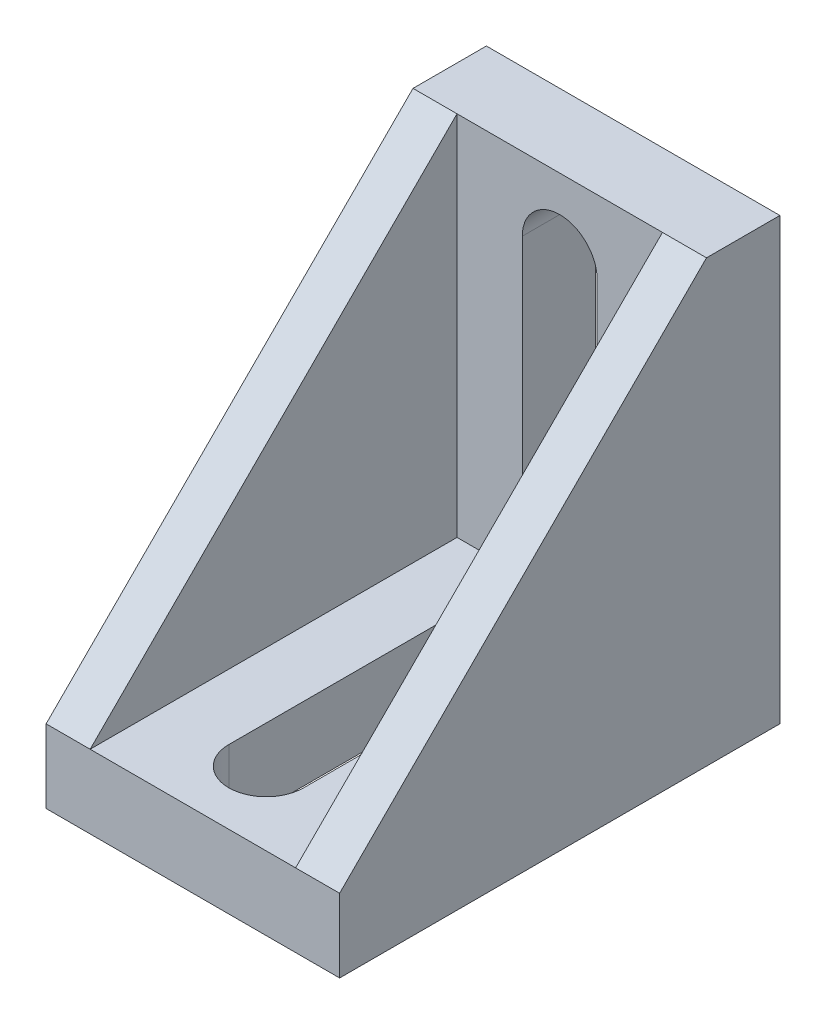
ISO-10303-21;
HEADER;
FILE_DESCRIPTION(('STEP AP214'),'2;1');
FILE_NAME('part.step','',(''),(''),'','','');
FILE_SCHEMA(('AUTOMOTIVE_DESIGN { 1 0 10303 214 1 1 1 1 }'));
ENDSEC;
DATA;
#1=APPLICATION_CONTEXT('core data for automotive mechanical design processes');
#2=APPLICATION_PROTOCOL_DEFINITION('international standard','automotive_design',2000,#1);
#3=PRODUCT_CONTEXT('',#1,'mechanical');
#4=PRODUCT('Part','Part','',(#3));
#5=PRODUCT_RELATED_PRODUCT_CATEGORY('part','',(#4));
#6=PRODUCT_DEFINITION_FORMATION('','',#4);
#7=PRODUCT_DEFINITION_CONTEXT('part definition',#1,'design');
#8=PRODUCT_DEFINITION('design','',#6,#7);
#9=PRODUCT_DEFINITION_SHAPE('','',#8);
#10=(LENGTH_UNIT() NAMED_UNIT(*) SI_UNIT(.MILLI.,.METRE.));
#11=(NAMED_UNIT(*) PLANE_ANGLE_UNIT() SI_UNIT($,.RADIAN.));
#12=(NAMED_UNIT(*) SI_UNIT($,.STERADIAN.) SOLID_ANGLE_UNIT());
#13=UNCERTAINTY_MEASURE_WITH_UNIT(LENGTH_MEASURE(1.E-05),#10,'distance_accuracy_value','');
#14=(GEOMETRIC_REPRESENTATION_CONTEXT(3) GLOBAL_UNCERTAINTY_ASSIGNED_CONTEXT((#13)) GLOBAL_UNIT_ASSIGNED_CONTEXT((#10,
#11,#12)) REPRESENTATION_CONTEXT('',''));
#15=CARTESIAN_POINT('',(0.,0.,0.));
#16=DIRECTION('',(0.,0.,1.));
#17=DIRECTION('',(1.,0.,0.));
#18=AXIS2_PLACEMENT_3D('',#15,#16,#17);
#19=CARTESIAN_POINT('',(0.,0.,30.));
#20=DIRECTION('',(0.,0.,-1.));
#21=DIRECTION('',(-1.,0.,0.));
#22=AXIS2_PLACEMENT_3D('',#19,#20,#21);
#23=PLANE('',#22);
#24=DIRECTION('',(0.,1.,0.));
#25=VECTOR('',#24,1.);
#26=CARTESIAN_POINT('',(20.,0.,30.));
#27=LINE('',#26,#25);
#28=CARTESIAN_POINT('',(20.,0.,30.));
#29=VERTEX_POINT('',#28);
#30=CARTESIAN_POINT('',(20.,5.,30.));
#31=VERTEX_POINT('',#30);
#32=EDGE_CURVE('E244',#29,#31,#27,.T.);
#33=ORIENTED_EDGE('',*,*,#32,.T.);
#34=DIRECTION('',(1.,0.,0.));
#35=VECTOR('',#34,1.);
#36=CARTESIAN_POINT('',(0.,5.,30.));
#37=LINE('',#36,#35);
#38=CARTESIAN_POINT('',(17.,5.,30.));
#39=VERTEX_POINT('',#38);
#40=EDGE_CURVE('E208',#39,#31,#37,.T.);
#41=ORIENTED_EDGE('',*,*,#40,.F.);
#42=DIRECTION('',(1.,0.,0.));
#43=VECTOR('',#42,1.);
#44=CARTESIAN_POINT('',(0.,5.,30.));
#45=LINE('',#44,#43);
#46=CARTESIAN_POINT('',(3.,5.,30.));
#47=VERTEX_POINT('',#46);
#48=EDGE_CURVE('E231',#47,#39,#45,.T.);
#49=ORIENTED_EDGE('',*,*,#48,.F.);
#50=CARTESIAN_POINT('',(0.,5.,30.));
#51=VERTEX_POINT('',#50);
#52=EDGE_CURVE('E205',#51,#47,#37,.T.);
#53=ORIENTED_EDGE('',*,*,#52,.F.);
#54=DIRECTION('',(0.,-1.,0.));
#55=VECTOR('',#54,1.);
#56=CARTESIAN_POINT('',(0.,0.,30.));
#57=LINE('',#56,#55);
#58=CARTESIAN_POINT('',(0.,0.,30.));
#59=VERTEX_POINT('',#58);
#60=EDGE_CURVE('E239',#51,#59,#57,.T.);
#61=ORIENTED_EDGE('',*,*,#60,.T.);
#62=DIRECTION('',(1.,0.,0.));
#63=VECTOR('',#62,1.);
#64=CARTESIAN_POINT('',(0.,0.,30.));
#65=LINE('',#64,#63);
#66=EDGE_CURVE('E241',#59,#29,#65,.T.);
#67=ORIENTED_EDGE('',*,*,#66,.T.);
#68=EDGE_LOOP('',(#33,#41,#49,#53,#61,#67));
#69=FACE_BOUND('',#68,.T.);
#70=ADVANCED_FACE('F38',(#69),#23,.F.);
#71=CARTESIAN_POINT('',(0.,0.,30.));
#72=DIRECTION('',(1.,0.,0.));
#73=DIRECTION('',(0.,0.,-1.));
#74=AXIS2_PLACEMENT_3D('',#71,#72,#73);
#75=PLANE('',#74);
#76=ORIENTED_EDGE('',*,*,#60,.F.);
#77=DIRECTION('',(0.,0.707106781186547,-0.707106781186547));
#78=VECTOR('',#77,1.);
#79=CARTESIAN_POINT('',(0.,5.,30.));
#80=LINE('',#79,#78);
#81=CARTESIAN_POINT('',(0.,30.,5.));
#82=VERTEX_POINT('',#81);
#83=EDGE_CURVE('E194',#51,#82,#80,.T.);
#84=ORIENTED_EDGE('',*,*,#83,.T.);
#85=DIRECTION('',(0.,0.,-1.));
#86=VECTOR('',#85,1.);
#87=CARTESIAN_POINT('',(0.,30.,30.));
#88=LINE('',#87,#86);
#89=CARTESIAN_POINT('',(0.,30.,0.));
#90=VERTEX_POINT('',#89);
#91=EDGE_CURVE('E247',#82,#90,#88,.T.);
#92=ORIENTED_EDGE('',*,*,#91,.T.);
#93=DIRECTION('',(0.,-1.,0.));
#94=VECTOR('',#93,1.);
#95=CARTESIAN_POINT('',(0.,0.,0.));
#96=LINE('',#95,#94);
#97=CARTESIAN_POINT('',(0.,0.,0.));
#98=VERTEX_POINT('',#97);
#99=EDGE_CURVE('E225',#90,#98,#96,.T.);
#100=ORIENTED_EDGE('',*,*,#99,.T.);
#101=DIRECTION('',(0.,0.,-1.));
#102=VECTOR('',#101,1.);
#103=CARTESIAN_POINT('',(0.,0.,30.));
#104=LINE('',#103,#102);
#105=EDGE_CURVE('E263',#59,#98,#104,.T.);
#106=ORIENTED_EDGE('',*,*,#105,.F.);
#107=EDGE_LOOP('',(#76,#84,#92,#100,#106));
#108=FACE_BOUND('',#107,.T.);
#109=ADVANCED_FACE('F40',(#108),#75,.F.);
#110=CARTESIAN_POINT('',(0.,0.,30.));
#111=DIRECTION('',(0.,1.,0.));
#112=DIRECTION('',(0.,0.,1.));
#113=AXIS2_PLACEMENT_3D('',#110,#111,#112);
#114=PLANE('',#113);
#115=DIRECTION('',(0.,0.,-1.));
#116=VECTOR('',#115,1.);
#117=CARTESIAN_POINT('',(7.4475,0.,25.));
#118=LINE('',#117,#116);
#119=CARTESIAN_POINT('',(7.4475,0.,25.));
#120=VERTEX_POINT('',#119);
#121=CARTESIAN_POINT('',(7.4475,-2.09901540593194E-13,10.0000000000001));
#122=VERTEX_POINT('',#121);
#123=EDGE_CURVE('E162',#120,#122,#118,.T.);
#124=ORIENTED_EDGE('',*,*,#123,.F.);
#125=CARTESIAN_POINT('',(10.,0.,25.));
#126=DIRECTION('',(0.,-1.,0.));
#127=DIRECTION('',(1.,0.,0.));
#128=AXIS2_PLACEMENT_3D('',#125,#126,#127);
#129=CIRCLE('',#128,2.5525);
#130=CARTESIAN_POINT('',(12.5525,0.,25.));
#131=VERTEX_POINT('',#130);
#132=EDGE_CURVE('E53',#131,#120,#129,.T.);
#133=ORIENTED_EDGE('',*,*,#132,.F.);
#134=DIRECTION('',(0.,0.,1.));
#135=VECTOR('',#134,1.);
#136=CARTESIAN_POINT('',(12.5525,0.,25.));
#137=LINE('',#136,#135);
#138=CARTESIAN_POINT('',(12.5525,-2.09901540593194E-13,10.0000000000001));
#139=VERTEX_POINT('',#138);
#140=EDGE_CURVE('E169',#139,#131,#137,.T.);
#141=ORIENTED_EDGE('',*,*,#140,.F.);
#142=CARTESIAN_POINT('',(10.,-2.09901540593194E-13,10.0000000000001));
#143=DIRECTION('',(0.,-1.,0.));
#144=DIRECTION('',(1.,0.,0.));
#145=AXIS2_PLACEMENT_3D('',#142,#143,#144);
#146=CIRCLE('',#145,2.5525);
#147=EDGE_CURVE('E153',#122,#139,#146,.T.);
#148=ORIENTED_EDGE('',*,*,#147,.F.);
#149=EDGE_LOOP('',(#124,#133,#141,#148));
#150=FACE_BOUND('',#149,.T.);
#151=DIRECTION('',(1.,0.,0.));
#152=VECTOR('',#151,1.);
#153=CARTESIAN_POINT('',(0.,0.,0.));
#154=LINE('',#153,#152);
#155=CARTESIAN_POINT('',(20.,0.,0.));
#156=VERTEX_POINT('',#155);
#157=EDGE_CURVE('E250',#98,#156,#154,.T.);
#158=ORIENTED_EDGE('',*,*,#157,.T.);
#159=DIRECTION('',(0.,0.,-1.));
#160=VECTOR('',#159,1.);
#161=CARTESIAN_POINT('',(20.,0.,30.));
#162=LINE('',#161,#160);
#163=EDGE_CURVE('E260',#29,#156,#162,.T.);
#164=ORIENTED_EDGE('',*,*,#163,.F.);
#165=ORIENTED_EDGE('',*,*,#66,.F.);
#166=ORIENTED_EDGE('',*,*,#105,.T.);
#167=EDGE_LOOP('',(#158,#164,#165,#166));
#168=FACE_BOUND('',#167,.T.);
#169=ADVANCED_FACE('F166',(#150,#168),#114,.F.);
#170=CARTESIAN_POINT('',(20.,0.,30.));
#171=DIRECTION('',(-1.,0.,0.));
#172=DIRECTION('',(0.,-1.,0.));
#173=AXIS2_PLACEMENT_3D('',#170,#171,#172);
#174=PLANE('',#173);
#175=DIRECTION('',(0.,0.,-1.));
#176=VECTOR('',#175,1.);
#177=CARTESIAN_POINT('',(20.,30.,30.));
#178=LINE('',#177,#176);
#179=CARTESIAN_POINT('',(20.,30.,5.));
#180=VERTEX_POINT('',#179);
#181=CARTESIAN_POINT('',(20.,30.,0.));
#182=VERTEX_POINT('',#181);
#183=EDGE_CURVE('E258',#180,#182,#178,.T.);
#184=ORIENTED_EDGE('',*,*,#183,.F.);
#185=DIRECTION('',(0.,-0.707106781186548,0.707106781186548));
#186=VECTOR('',#185,1.);
#187=CARTESIAN_POINT('',(20.,2.5,32.5));
#188=LINE('',#187,#186);
#189=EDGE_CURVE('E215',#180,#31,#188,.T.);
#190=ORIENTED_EDGE('',*,*,#189,.T.);
#191=ORIENTED_EDGE('',*,*,#32,.F.);
#192=ORIENTED_EDGE('',*,*,#163,.T.);
#193=DIRECTION('',(0.,1.,0.));
#194=VECTOR('',#193,1.);
#195=CARTESIAN_POINT('',(20.,0.,0.));
#196=LINE('',#195,#194);
#197=EDGE_CURVE('E252',#156,#182,#196,.T.);
#198=ORIENTED_EDGE('',*,*,#197,.T.);
#199=EDGE_LOOP('',(#184,#190,#191,#192,#198));
#200=FACE_BOUND('',#199,.T.);
#201=ADVANCED_FACE('F321',(#200),#174,.F.);
#202=CARTESIAN_POINT('',(0.,30.,30.));
#203=DIRECTION('',(0.,-1.,0.));
#204=DIRECTION('',(0.,0.,-1.));
#205=AXIS2_PLACEMENT_3D('',#202,#203,#204);
#206=PLANE('',#205);
#207=ORIENTED_EDGE('',*,*,#91,.F.);
#208=DIRECTION('',(1.,0.,0.));
#209=VECTOR('',#208,1.);
#210=CARTESIAN_POINT('',(0.,30.,5.));
#211=LINE('',#210,#209);
#212=CARTESIAN_POINT('',(3.,30.,5.));
#213=VERTEX_POINT('',#212);
#214=EDGE_CURVE('E209',#82,#213,#211,.T.);
#215=ORIENTED_EDGE('',*,*,#214,.T.);
#216=DIRECTION('',(-1.,0.,0.));
#217=VECTOR('',#216,1.);
#218=CARTESIAN_POINT('',(0.,30.,5.));
#219=LINE('',#218,#217);
#220=CARTESIAN_POINT('',(17.,30.,5.));
#221=VERTEX_POINT('',#220);
#222=EDGE_CURVE('E234',#221,#213,#219,.T.);
#223=ORIENTED_EDGE('',*,*,#222,.F.);
#224=EDGE_CURVE('E204',#221,#180,#211,.T.);
#225=ORIENTED_EDGE('',*,*,#224,.T.);
#226=ORIENTED_EDGE('',*,*,#183,.T.);
#227=DIRECTION('',(-1.,0.,0.));
#228=VECTOR('',#227,1.);
#229=CARTESIAN_POINT('',(0.,30.,0.));
#230=LINE('',#229,#228);
#231=EDGE_CURVE('E242',#182,#90,#230,.T.);
#232=ORIENTED_EDGE('',*,*,#231,.T.);
#233=EDGE_LOOP('',(#207,#215,#223,#225,#226,#232));
#234=FACE_BOUND('',#233,.T.);
#235=ADVANCED_FACE('F317',(#234),#206,.F.);
#236=CARTESIAN_POINT('',(0.,0.,0.));
#237=DIRECTION('',(0.,0.,-1.));
#238=DIRECTION('',(-1.,0.,0.));
#239=AXIS2_PLACEMENT_3D('',#236,#237,#238);
#240=PLANE('',#239);
#241=CARTESIAN_POINT('',(10.,25.,0.));
#242=DIRECTION('',(0.,0.,1.));
#243=DIRECTION('',(1.,0.,0.));
#244=AXIS2_PLACEMENT_3D('',#241,#242,#243);
#245=CIRCLE('',#244,2.5525);
#246=CARTESIAN_POINT('',(12.5525,25.,0.));
#247=VERTEX_POINT('',#246);
#248=CARTESIAN_POINT('',(7.4475,25.,0.));
#249=VERTEX_POINT('',#248);
#250=EDGE_CURVE('E176',#247,#249,#245,.T.);
#251=ORIENTED_EDGE('',*,*,#250,.T.);
#252=DIRECTION('',(0.,-1.,0.));
#253=VECTOR('',#252,1.);
#254=CARTESIAN_POINT('',(7.4475,25.,0.));
#255=LINE('',#254,#253);
#256=CARTESIAN_POINT('',(7.4475,10.,0.));
#257=VERTEX_POINT('',#256);
#258=EDGE_CURVE('E181',#249,#257,#255,.T.);
#259=ORIENTED_EDGE('',*,*,#258,.T.);
#260=CARTESIAN_POINT('',(10.,10.,0.));
#261=DIRECTION('',(0.,0.,1.));
#262=DIRECTION('',(1.,0.,0.));
#263=AXIS2_PLACEMENT_3D('',#260,#261,#262);
#264=CIRCLE('',#263,2.5525);
#265=CARTESIAN_POINT('',(12.5525,10.,0.));
#266=VERTEX_POINT('',#265);
#267=EDGE_CURVE('E184',#257,#266,#264,.T.);
#268=ORIENTED_EDGE('',*,*,#267,.T.);
#269=DIRECTION('',(0.,1.,0.));
#270=VECTOR('',#269,1.);
#271=CARTESIAN_POINT('',(12.5525,25.,0.));
#272=LINE('',#271,#270);
#273=EDGE_CURVE('E187',#266,#247,#272,.T.);
#274=ORIENTED_EDGE('',*,*,#273,.T.);
#275=EDGE_LOOP('',(#251,#259,#268,#274));
#276=FACE_BOUND('',#275,.T.);
#277=ORIENTED_EDGE('',*,*,#99,.F.);
#278=ORIENTED_EDGE('',*,*,#231,.F.);
#279=ORIENTED_EDGE('',*,*,#197,.F.);
#280=ORIENTED_EDGE('',*,*,#157,.F.);
#281=EDGE_LOOP('',(#277,#278,#279,#280));
#282=FACE_BOUND('',#281,.T.);
#283=ADVANCED_FACE('F313',(#276,#282),#240,.T.);
#284=CARTESIAN_POINT('',(3.,0.,30.));
#285=DIRECTION('',(1.,0.,0.));
#286=DIRECTION('',(0.,0.,-1.));
#287=AXIS2_PLACEMENT_3D('',#284,#285,#286);
#288=PLANE('',#287);
#289=DIRECTION('',(0.,0.707106781186548,-0.707106781186548));
#290=VECTOR('',#289,1.);
#291=CARTESIAN_POINT('',(3.,2.5,32.5));
#292=LINE('',#291,#290);
#293=EDGE_CURVE('E213',#47,#213,#292,.T.);
#294=ORIENTED_EDGE('',*,*,#293,.F.);
#295=DIRECTION('',(0.,0.,-1.));
#296=VECTOR('',#295,1.);
#297=CARTESIAN_POINT('',(3.,5.,30.));
#298=LINE('',#297,#296);
#299=CARTESIAN_POINT('',(3.,5.,5.));
#300=VERTEX_POINT('',#299);
#301=EDGE_CURVE('E222',#47,#300,#298,.T.);
#302=ORIENTED_EDGE('',*,*,#301,.T.);
#303=DIRECTION('',(0.,-1.,0.));
#304=VECTOR('',#303,1.);
#305=CARTESIAN_POINT('',(3.,0.,5.));
#306=LINE('',#305,#304);
#307=EDGE_CURVE('E218',#213,#300,#306,.T.);
#308=ORIENTED_EDGE('',*,*,#307,.F.);
#309=EDGE_LOOP('',(#294,#302,#308));
#310=FACE_BOUND('',#309,.T.);
#311=ADVANCED_FACE('F316',(#310),#288,.T.);
#312=CARTESIAN_POINT('',(0.,5.,30.));
#313=DIRECTION('',(0.,1.,0.));
#314=DIRECTION('',(0.,0.,1.));
#315=AXIS2_PLACEMENT_3D('',#312,#313,#314);
#316=PLANE('',#315);
#317=CARTESIAN_POINT('',(10.,5.,25.));
#318=DIRECTION('',(0.,1.,0.));
#319=DIRECTION('',(0.,0.,1.));
#320=AXIS2_PLACEMENT_3D('',#317,#318,#319);
#321=CIRCLE('',#320,2.5525);
#322=CARTESIAN_POINT('',(7.4475,5.,25.));
#323=VERTEX_POINT('',#322);
#324=CARTESIAN_POINT('',(12.5525,5.,25.));
#325=VERTEX_POINT('',#324);
#326=EDGE_CURVE('E12',#323,#325,#321,.T.);
#327=ORIENTED_EDGE('',*,*,#326,.F.);
#328=DIRECTION('',(0.,0.,1.));
#329=VECTOR('',#328,1.);
#330=CARTESIAN_POINT('',(7.4475,5.,30.));
#331=LINE('',#330,#329);
#332=CARTESIAN_POINT('',(7.4475,5.,9.99999999999974));
#333=VERTEX_POINT('',#332);
#334=EDGE_CURVE('E278',#333,#323,#331,.T.);
#335=ORIENTED_EDGE('',*,*,#334,.F.);
#336=CARTESIAN_POINT('',(10.,5.,10.));
#337=DIRECTION('',(0.,1.,0.));
#338=DIRECTION('',(0.,0.,1.));
#339=AXIS2_PLACEMENT_3D('',#336,#337,#338);
#340=CIRCLE('',#339,2.5525);
#341=CARTESIAN_POINT('',(12.5525,5.,10.));
#342=VERTEX_POINT('',#341);
#343=EDGE_CURVE('E156',#342,#333,#340,.T.);
#344=ORIENTED_EDGE('',*,*,#343,.F.);
#345=DIRECTION('',(0.,0.,-1.));
#346=VECTOR('',#345,1.);
#347=CARTESIAN_POINT('',(12.5525,5.,30.));
#348=LINE('',#347,#346);
#349=EDGE_CURVE('E46',#325,#342,#348,.T.);
#350=ORIENTED_EDGE('',*,*,#349,.F.);
#351=EDGE_LOOP('',(#327,#335,#344,#350));
#352=FACE_BOUND('',#351,.T.);
#353=DIRECTION('',(1.,0.,0.));
#354=VECTOR('',#353,1.);
#355=CARTESIAN_POINT('',(0.,5.,5.));
#356=LINE('',#355,#354);
#357=CARTESIAN_POINT('',(17.,5.,5.));
#358=VERTEX_POINT('',#357);
#359=EDGE_CURVE('E221',#300,#358,#356,.T.);
#360=ORIENTED_EDGE('',*,*,#359,.F.);
#361=ORIENTED_EDGE('',*,*,#301,.F.);
#362=ORIENTED_EDGE('',*,*,#48,.T.);
#363=DIRECTION('',(0.,0.,-1.));
#364=VECTOR('',#363,1.);
#365=CARTESIAN_POINT('',(17.,5.,30.));
#366=LINE('',#365,#364);
#367=EDGE_CURVE('E226',#39,#358,#366,.T.);
#368=ORIENTED_EDGE('',*,*,#367,.T.);
#369=EDGE_LOOP('',(#360,#361,#362,#368));
#370=FACE_BOUND('',#369,.T.);
#371=ADVANCED_FACE('F286',(#352,#370),#316,.T.);
#372=CARTESIAN_POINT('',(17.,0.,30.));
#373=DIRECTION('',(-1.,0.,0.));
#374=DIRECTION('',(0.,-1.,0.));
#375=AXIS2_PLACEMENT_3D('',#372,#373,#374);
#376=PLANE('',#375);
#377=DIRECTION('',(0.,-0.707106781186548,0.707106781186548));
#378=VECTOR('',#377,1.);
#379=CARTESIAN_POINT('',(17.,2.5,32.5));
#380=LINE('',#379,#378);
#381=EDGE_CURVE('E207',#221,#39,#380,.T.);
#382=ORIENTED_EDGE('',*,*,#381,.F.);
#383=DIRECTION('',(0.,1.,0.));
#384=VECTOR('',#383,1.);
#385=CARTESIAN_POINT('',(17.,0.,5.));
#386=LINE('',#385,#384);
#387=EDGE_CURVE('E228',#358,#221,#386,.T.);
#388=ORIENTED_EDGE('',*,*,#387,.F.);
#389=ORIENTED_EDGE('',*,*,#367,.F.);
#390=EDGE_LOOP('',(#382,#388,#389));
#391=FACE_BOUND('',#390,.T.);
#392=ADVANCED_FACE('F359',(#391),#376,.T.);
#393=CARTESIAN_POINT('',(0.,0.,5.));
#394=DIRECTION('',(0.,0.,-1.));
#395=DIRECTION('',(-1.,0.,0.));
#396=AXIS2_PLACEMENT_3D('',#393,#394,#395);
#397=PLANE('',#396);
#398=DIRECTION('',(0.,1.,0.));
#399=VECTOR('',#398,1.);
#400=CARTESIAN_POINT('',(7.4475,0.,5.));
#401=LINE('',#400,#399);
#402=CARTESIAN_POINT('',(7.4475,10.,5.));
#403=VERTEX_POINT('',#402);
#404=CARTESIAN_POINT('',(7.4475,25.,5.));
#405=VERTEX_POINT('',#404);
#406=EDGE_CURVE('E266',#403,#405,#401,.T.);
#407=ORIENTED_EDGE('',*,*,#406,.T.);
#408=CARTESIAN_POINT('',(10.,25.,5.));
#409=DIRECTION('',(0.,0.,-1.));
#410=DIRECTION('',(-1.,0.,0.));
#411=AXIS2_PLACEMENT_3D('',#408,#409,#410);
#412=CIRCLE('',#411,2.5525);
#413=CARTESIAN_POINT('',(12.5525,25.,5.));
#414=VERTEX_POINT('',#413);
#415=EDGE_CURVE('E275',#405,#414,#412,.T.);
#416=ORIENTED_EDGE('',*,*,#415,.T.);
#417=DIRECTION('',(0.,-1.,0.));
#418=VECTOR('',#417,1.);
#419=CARTESIAN_POINT('',(12.5525,0.,5.));
#420=LINE('',#419,#418);
#421=CARTESIAN_POINT('',(12.5525,10.,5.));
#422=VERTEX_POINT('',#421);
#423=EDGE_CURVE('E272',#414,#422,#420,.T.);
#424=ORIENTED_EDGE('',*,*,#423,.T.);
#425=CARTESIAN_POINT('',(10.,10.,5.));
#426=DIRECTION('',(0.,0.,-1.));
#427=DIRECTION('',(-1.,0.,0.));
#428=AXIS2_PLACEMENT_3D('',#425,#426,#427);
#429=CIRCLE('',#428,2.5525);
#430=EDGE_CURVE('E269',#422,#403,#429,.T.);
#431=ORIENTED_EDGE('',*,*,#430,.T.);
#432=EDGE_LOOP('',(#407,#416,#424,#431));
#433=FACE_BOUND('',#432,.T.);
#434=ORIENTED_EDGE('',*,*,#307,.T.);
#435=ORIENTED_EDGE('',*,*,#359,.T.);
#436=ORIENTED_EDGE('',*,*,#387,.T.);
#437=ORIENTED_EDGE('',*,*,#222,.T.);
#438=EDGE_LOOP('',(#434,#435,#436,#437));
#439=FACE_BOUND('',#438,.T.);
#440=ADVANCED_FACE('F311',(#433,#439),#397,.F.);
#441=CARTESIAN_POINT('',(0.,5.,30.));
#442=DIRECTION('',(0.,-0.707106781186548,-0.707106781186548));
#443=DIRECTION('',(0.,0.707106781186548,-0.707106781186548));
#444=AXIS2_PLACEMENT_3D('',#441,#442,#443);
#445=PLANE('',#444);
#446=ORIENTED_EDGE('',*,*,#224,.F.);
#447=ORIENTED_EDGE('',*,*,#381,.T.);
#448=ORIENTED_EDGE('',*,*,#40,.T.);
#449=ORIENTED_EDGE('',*,*,#189,.F.);
#450=EDGE_LOOP('',(#446,#447,#448,#449));
#451=FACE_BOUND('',#450,.T.);
#452=ADVANCED_FACE('F371',(#451),#445,.F.);
#453=ORIENTED_EDGE('',*,*,#293,.T.);
#454=ORIENTED_EDGE('',*,*,#214,.F.);
#455=ORIENTED_EDGE('',*,*,#83,.F.);
#456=ORIENTED_EDGE('',*,*,#52,.T.);
#457=EDGE_LOOP('',(#453,#454,#455,#456));
#458=FACE_BOUND('',#457,.T.);
#459=ADVANCED_FACE('F378',(#458),#445,.F.);
#460=CARTESIAN_POINT('',(10.,25.,0.));
#461=DIRECTION('',(0.,0.,1.));
#462=DIRECTION('',(1.,0.,0.));
#463=AXIS2_PLACEMENT_3D('',#460,#461,#462);
#464=CYLINDRICAL_SURFACE('',#463,2.5525);
#465=DIRECTION('',(0.,0.,1.));
#466=VECTOR('',#465,1.);
#467=CARTESIAN_POINT('',(7.4475,25.,0.));
#468=LINE('',#467,#466);
#469=EDGE_CURVE('E190',#249,#405,#468,.T.);
#470=ORIENTED_EDGE('',*,*,#469,.F.);
#471=ORIENTED_EDGE('',*,*,#250,.F.);
#472=DIRECTION('',(0.,0.,1.));
#473=VECTOR('',#472,1.);
#474=CARTESIAN_POINT('',(12.5525,25.,0.));
#475=LINE('',#474,#473);
#476=EDGE_CURVE('E191',#247,#414,#475,.T.);
#477=ORIENTED_EDGE('',*,*,#476,.T.);
#478=ORIENTED_EDGE('',*,*,#415,.F.);
#479=EDGE_LOOP('',(#470,#471,#477,#478));
#480=FACE_BOUND('',#479,.T.);
#481=ADVANCED_FACE('F385',(#480),#464,.F.);
#482=CARTESIAN_POINT('',(12.5525,25.,0.));
#483=DIRECTION('',(1.,0.,0.));
#484=DIRECTION('',(0.,1.,0.));
#485=AXIS2_PLACEMENT_3D('',#482,#483,#484);
#486=PLANE('',#485);
#487=ORIENTED_EDGE('',*,*,#476,.F.);
#488=ORIENTED_EDGE('',*,*,#273,.F.);
#489=DIRECTION('',(0.,0.,1.));
#490=VECTOR('',#489,1.);
#491=CARTESIAN_POINT('',(12.5525,10.,0.));
#492=LINE('',#491,#490);
#493=EDGE_CURVE('E195',#266,#422,#492,.T.);
#494=ORIENTED_EDGE('',*,*,#493,.T.);
#495=ORIENTED_EDGE('',*,*,#423,.F.);
#496=EDGE_LOOP('',(#487,#488,#494,#495));
#497=FACE_BOUND('',#496,.T.);
#498=ADVANCED_FACE('F391',(#497),#486,.F.);
#499=CARTESIAN_POINT('',(10.,10.,0.));
#500=DIRECTION('',(0.,0.,1.));
#501=DIRECTION('',(1.,0.,0.));
#502=AXIS2_PLACEMENT_3D('',#499,#500,#501);
#503=CYLINDRICAL_SURFACE('',#502,2.5525);
#504=ORIENTED_EDGE('',*,*,#493,.F.);
#505=ORIENTED_EDGE('',*,*,#267,.F.);
#506=DIRECTION('',(0.,0.,1.));
#507=VECTOR('',#506,1.);
#508=CARTESIAN_POINT('',(7.4475,10.,0.));
#509=LINE('',#508,#507);
#510=EDGE_CURVE('E198',#257,#403,#509,.T.);
#511=ORIENTED_EDGE('',*,*,#510,.T.);
#512=ORIENTED_EDGE('',*,*,#430,.F.);
#513=EDGE_LOOP('',(#504,#505,#511,#512));
#514=FACE_BOUND('',#513,.T.);
#515=ADVANCED_FACE('F297',(#514),#503,.F.);
#516=CARTESIAN_POINT('',(7.4475,25.,0.));
#517=DIRECTION('',(-1.,0.,0.));
#518=DIRECTION('',(0.,-1.,0.));
#519=AXIS2_PLACEMENT_3D('',#516,#517,#518);
#520=PLANE('',#519);
#521=ORIENTED_EDGE('',*,*,#510,.F.);
#522=ORIENTED_EDGE('',*,*,#258,.F.);
#523=ORIENTED_EDGE('',*,*,#469,.T.);
#524=ORIENTED_EDGE('',*,*,#406,.F.);
#525=EDGE_LOOP('',(#521,#522,#523,#524));
#526=FACE_BOUND('',#525,.T.);
#527=ADVANCED_FACE('F290',(#526),#520,.F.);
#528=CARTESIAN_POINT('',(10.,30.0000000000003,24.9999999999997));
#529=DIRECTION('',(0.,-1.,0.));
#530=DIRECTION('',(0.,0.,-1.));
#531=AXIS2_PLACEMENT_3D('',#528,#529,#530);
#532=CYLINDRICAL_SURFACE('',#531,2.5525);
#533=ORIENTED_EDGE('',*,*,#326,.T.);
#534=DIRECTION('',(0.,-1.,0.));
#535=VECTOR('',#534,1.);
#536=CARTESIAN_POINT('',(12.5525,30.0000000000003,24.9999999999997));
#537=LINE('',#536,#535);
#538=EDGE_CURVE('E174',#325,#131,#537,.T.);
#539=ORIENTED_EDGE('',*,*,#538,.T.);
#540=ORIENTED_EDGE('',*,*,#132,.T.);
#541=DIRECTION('',(0.,-1.,0.));
#542=VECTOR('',#541,1.);
#543=CARTESIAN_POINT('',(7.4475,30.0000000000003,24.9999999999997));
#544=LINE('',#543,#542);
#545=EDGE_CURVE('E159',#323,#120,#544,.T.);
#546=ORIENTED_EDGE('',*,*,#545,.F.);
#547=EDGE_LOOP('',(#533,#539,#540,#546));
#548=FACE_BOUND('',#547,.T.);
#549=ADVANCED_FACE('F288',(#548),#532,.F.);
#550=CARTESIAN_POINT('',(12.5525,30.0000000000003,24.9999999999997));
#551=DIRECTION('',(1.,0.,0.));
#552=DIRECTION('',(0.,0.,-1.));
#553=AXIS2_PLACEMENT_3D('',#550,#551,#552);
#554=PLANE('',#553);
#555=ORIENTED_EDGE('',*,*,#349,.T.);
#556=DIRECTION('',(0.,-1.,0.));
#557=VECTOR('',#556,1.);
#558=CARTESIAN_POINT('',(12.5525,30.0000000000001,9.99999999999974));
#559=LINE('',#558,#557);
#560=EDGE_CURVE('E158',#342,#139,#559,.T.);
#561=ORIENTED_EDGE('',*,*,#560,.T.);
#562=ORIENTED_EDGE('',*,*,#140,.T.);
#563=ORIENTED_EDGE('',*,*,#538,.F.);
#564=EDGE_LOOP('',(#555,#561,#562,#563));
#565=FACE_BOUND('',#564,.T.);
#566=ADVANCED_FACE('F283',(#565),#554,.F.);
#567=CARTESIAN_POINT('',(10.,30.0000000000001,9.99999999999974));
#568=DIRECTION('',(0.,-1.,0.));
#569=DIRECTION('',(0.,0.,-1.));
#570=AXIS2_PLACEMENT_3D('',#567,#568,#569);
#571=CYLINDRICAL_SURFACE('',#570,2.5525);
#572=ORIENTED_EDGE('',*,*,#343,.T.);
#573=DIRECTION('',(0.,-1.,0.));
#574=VECTOR('',#573,1.);
#575=CARTESIAN_POINT('',(7.4475,30.0000000000001,9.99999999999974));
#576=LINE('',#575,#574);
#577=EDGE_CURVE('E61',#333,#122,#576,.T.);
#578=ORIENTED_EDGE('',*,*,#577,.T.);
#579=ORIENTED_EDGE('',*,*,#147,.T.);
#580=ORIENTED_EDGE('',*,*,#560,.F.);
#581=EDGE_LOOP('',(#572,#578,#579,#580));
#582=FACE_BOUND('',#581,.T.);
#583=ADVANCED_FACE('F150',(#582),#571,.F.);
#584=CARTESIAN_POINT('',(7.4475,30.0000000000003,24.9999999999997));
#585=DIRECTION('',(-1.,0.,0.));
#586=DIRECTION('',(0.,0.,1.));
#587=AXIS2_PLACEMENT_3D('',#584,#585,#586);
#588=PLANE('',#587);
#589=ORIENTED_EDGE('',*,*,#334,.T.);
#590=ORIENTED_EDGE('',*,*,#545,.T.);
#591=ORIENTED_EDGE('',*,*,#123,.T.);
#592=ORIENTED_EDGE('',*,*,#577,.F.);
#593=EDGE_LOOP('',(#589,#590,#591,#592));
#594=FACE_BOUND('',#593,.T.);
#595=ADVANCED_FACE('F163',(#594),#588,.F.);
#596=CLOSED_SHELL('',(#70,#109,#169,#201,#235,#283,#311,#371,#392,#440,#452,#459,#481,#498,#515,
#527,#549,#566,#583,#595));
#597=MANIFOLD_SOLID_BREP('B2',#596);
#598=ADVANCED_BREP_SHAPE_REPRESENTATION('',(#18,#597),#14);
#599=SHAPE_DEFINITION_REPRESENTATION(#9,#598);
ENDSEC;
END-ISO-10303-21;
